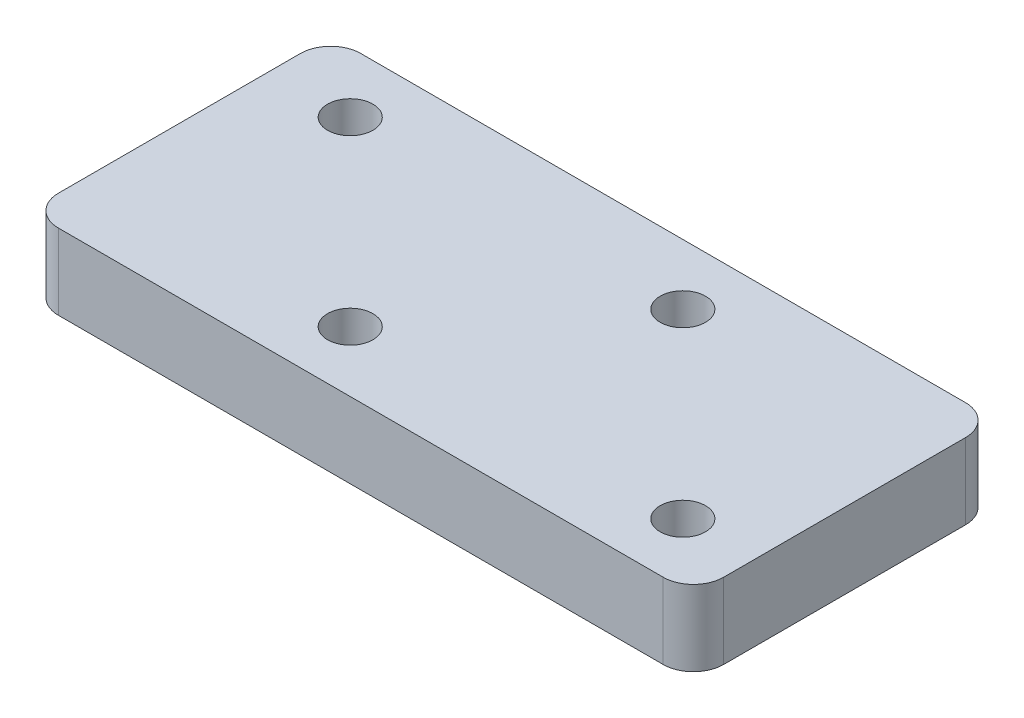
ISO-10303-21;
HEADER;
FILE_DESCRIPTION(('STEP AP214'),'2;1');
FILE_NAME('part.step','',(''),(''),'','','');
FILE_SCHEMA(('AUTOMOTIVE_DESIGN { 1 0 10303 214 1 1 1 1 }'));
ENDSEC;
DATA;
#1=APPLICATION_CONTEXT('core data for automotive mechanical design processes');
#2=APPLICATION_PROTOCOL_DEFINITION('international standard','automotive_design',2000,#1);
#3=PRODUCT_CONTEXT('',#1,'mechanical');
#4=PRODUCT('Part','Part','',(#3));
#5=PRODUCT_RELATED_PRODUCT_CATEGORY('part','',(#4));
#6=PRODUCT_DEFINITION_FORMATION('','',#4);
#7=PRODUCT_DEFINITION_CONTEXT('part definition',#1,'design');
#8=PRODUCT_DEFINITION('design','',#6,#7);
#9=PRODUCT_DEFINITION_SHAPE('','',#8);
#10=(LENGTH_UNIT() NAMED_UNIT(*) SI_UNIT(.MILLI.,.METRE.));
#11=(NAMED_UNIT(*) PLANE_ANGLE_UNIT() SI_UNIT($,.RADIAN.));
#12=(NAMED_UNIT(*) SI_UNIT($,.STERADIAN.) SOLID_ANGLE_UNIT());
#13=UNCERTAINTY_MEASURE_WITH_UNIT(LENGTH_MEASURE(1.E-05),#10,'distance_accuracy_value','');
#14=(GEOMETRIC_REPRESENTATION_CONTEXT(3) GLOBAL_UNCERTAINTY_ASSIGNED_CONTEXT((#13)) GLOBAL_UNIT_ASSIGNED_CONTEXT((#10,
#11,#12)) REPRESENTATION_CONTEXT('',''));
#15=CARTESIAN_POINT('',(0.,0.,0.));
#16=DIRECTION('',(0.,0.,1.));
#17=DIRECTION('',(1.,0.,0.));
#18=AXIS2_PLACEMENT_3D('',#15,#16,#17);
#19=CARTESIAN_POINT('',(0.,5.,0.));
#20=DIRECTION('',(0.,-1.,0.));
#21=DIRECTION('',(0.,0.,-1.));
#22=AXIS2_PLACEMENT_3D('',#19,#20,#21);
#23=PLANE('',#22);
#24=DIRECTION('',(0.,0.,-1.));
#25=VECTOR('',#24,1.);
#26=CARTESIAN_POINT('',(44.,5.,0.));
#27=LINE('',#26,#25);
#28=CARTESIAN_POINT('',(44.,5.,-2.));
#29=VERTEX_POINT('',#28);
#30=CARTESIAN_POINT('',(44.,5.,-18.));
#31=VERTEX_POINT('',#30);
#32=EDGE_CURVE('E202',#29,#31,#27,.T.);
#33=ORIENTED_EDGE('',*,*,#32,.T.);
#34=CARTESIAN_POINT('',(42.,5.,-18.));
#35=DIRECTION('',(0.,-1.,0.));
#36=DIRECTION('',(0.,0.,-1.));
#37=AXIS2_PLACEMENT_3D('',#34,#35,#36);
#38=CIRCLE('',#37,2.);
#39=CARTESIAN_POINT('',(42.,5.,-20.));
#40=VERTEX_POINT('',#39);
#41=EDGE_CURVE('E174',#31,#40,#38,.F.);
#42=ORIENTED_EDGE('',*,*,#41,.T.);
#43=DIRECTION('',(-1.,0.,0.));
#44=VECTOR('',#43,1.);
#45=CARTESIAN_POINT('',(0.,5.,-20.));
#46=LINE('',#45,#44);
#47=CARTESIAN_POINT('',(2.,5.,-20.));
#48=VERTEX_POINT('',#47);
#49=EDGE_CURVE('E135',#40,#48,#46,.T.);
#50=ORIENTED_EDGE('',*,*,#49,.T.);
#51=CARTESIAN_POINT('',(2.,5.,-18.));
#52=DIRECTION('',(0.,-1.,0.));
#53=DIRECTION('',(0.,0.,-1.));
#54=AXIS2_PLACEMENT_3D('',#51,#52,#53);
#55=CIRCLE('',#54,2.);
#56=CARTESIAN_POINT('',(0.,5.,-18.));
#57=VERTEX_POINT('',#56);
#58=EDGE_CURVE('E167',#48,#57,#55,.F.);
#59=ORIENTED_EDGE('',*,*,#58,.T.);
#60=DIRECTION('',(0.,0.,1.));
#61=VECTOR('',#60,1.);
#62=CARTESIAN_POINT('',(0.,5.,0.));
#63=LINE('',#62,#61);
#64=CARTESIAN_POINT('',(0.,5.,-2.));
#65=VERTEX_POINT('',#64);
#66=EDGE_CURVE('E143',#57,#65,#63,.T.);
#67=ORIENTED_EDGE('',*,*,#66,.T.);
#68=CARTESIAN_POINT('',(2.,5.,-2.));
#69=DIRECTION('',(0.,-1.,0.));
#70=DIRECTION('',(0.,0.,-1.));
#71=AXIS2_PLACEMENT_3D('',#68,#69,#70);
#72=CIRCLE('',#71,2.);
#73=CARTESIAN_POINT('',(2.,5.,0.));
#74=VERTEX_POINT('',#73);
#75=EDGE_CURVE('E70',#65,#74,#72,.F.);
#76=ORIENTED_EDGE('',*,*,#75,.T.);
#77=DIRECTION('',(1.,0.,0.));
#78=VECTOR('',#77,1.);
#79=CARTESIAN_POINT('',(0.,5.,0.));
#80=LINE('',#79,#78);
#81=CARTESIAN_POINT('',(42.,5.,0.));
#82=VERTEX_POINT('',#81);
#83=EDGE_CURVE('E148',#74,#82,#80,.T.);
#84=ORIENTED_EDGE('',*,*,#83,.T.);
#85=CARTESIAN_POINT('',(42.,5.,-2.));
#86=DIRECTION('',(0.,-1.,0.));
#87=DIRECTION('',(0.,0.,-1.));
#88=AXIS2_PLACEMENT_3D('',#85,#86,#87);
#89=CIRCLE('',#88,2.);
#90=EDGE_CURVE('E173',#82,#29,#89,.F.);
#91=ORIENTED_EDGE('',*,*,#90,.T.);
#92=EDGE_LOOP('',(#33,#42,#50,#59,#67,#76,#84,#91));
#93=FACE_BOUND('',#92,.T.);
#94=CARTESIAN_POINT('',(5.3,5.,-16.));
#95=DIRECTION('',(0.,1.,0.));
#96=DIRECTION('',(0.,0.,1.));
#97=AXIS2_PLACEMENT_3D('',#94,#95,#96);
#98=CIRCLE('',#97,1.5);
#99=CARTESIAN_POINT('',(5.3,5.,-14.5));
#100=VERTEX_POINT('',#99);
#101=EDGE_CURVE('E193',#100,#100,#98,.T.);
#102=ORIENTED_EDGE('',*,*,#101,.F.);
#103=EDGE_LOOP('',(#102));
#104=FACE_BOUND('',#103,.T.);
#105=CARTESIAN_POINT('',(17.3,5.,-4.));
#106=DIRECTION('',(0.,1.,0.));
#107=DIRECTION('',(0.,0.,1.));
#108=AXIS2_PLACEMENT_3D('',#105,#106,#107);
#109=CIRCLE('',#108,1.5);
#110=CARTESIAN_POINT('',(17.3,5.,-2.5));
#111=VERTEX_POINT('',#110);
#112=EDGE_CURVE('E213',#111,#111,#109,.T.);
#113=ORIENTED_EDGE('',*,*,#112,.F.);
#114=EDGE_LOOP('',(#113));
#115=FACE_BOUND('',#114,.T.);
#116=CARTESIAN_POINT('',(27.3,5.,-16.));
#117=DIRECTION('',(0.,1.,0.));
#118=DIRECTION('',(0.,0.,1.));
#119=AXIS2_PLACEMENT_3D('',#116,#117,#118);
#120=CIRCLE('',#119,1.5);
#121=CARTESIAN_POINT('',(27.3,5.,-14.5));
#122=VERTEX_POINT('',#121);
#123=EDGE_CURVE('E218',#122,#122,#120,.T.);
#124=ORIENTED_EDGE('',*,*,#123,.F.);
#125=EDGE_LOOP('',(#124));
#126=FACE_BOUND('',#125,.T.);
#127=CARTESIAN_POINT('',(39.3,5.,-4.));
#128=DIRECTION('',(0.,1.,0.));
#129=DIRECTION('',(0.,0.,1.));
#130=AXIS2_PLACEMENT_3D('',#127,#128,#129);
#131=CIRCLE('',#130,1.5);
#132=CARTESIAN_POINT('',(39.3,5.,-2.5));
#133=VERTEX_POINT('',#132);
#134=EDGE_CURVE('E230',#133,#133,#131,.T.);
#135=ORIENTED_EDGE('',*,*,#134,.F.);
#136=EDGE_LOOP('',(#135));
#137=FACE_BOUND('',#136,.T.);
#138=ADVANCED_FACE('F42',(#93,#104,#115,#126,#137),#23,.F.);
#139=CARTESIAN_POINT('',(0.,0.,0.));
#140=DIRECTION('',(0.,-1.,0.));
#141=DIRECTION('',(0.,0.,-1.));
#142=AXIS2_PLACEMENT_3D('',#139,#140,#141);
#143=PLANE('',#142);
#144=CARTESIAN_POINT('',(27.3,0.,-16.));
#145=DIRECTION('',(0.,1.,0.));
#146=DIRECTION('',(0.,0.,1.));
#147=AXIS2_PLACEMENT_3D('',#144,#145,#146);
#148=CIRCLE('',#147,1.5);
#149=CARTESIAN_POINT('',(27.3,0.,-14.5));
#150=VERTEX_POINT('',#149);
#151=EDGE_CURVE('E224',#150,#150,#148,.T.);
#152=ORIENTED_EDGE('',*,*,#151,.T.);
#153=EDGE_LOOP('',(#152));
#154=FACE_BOUND('',#153,.T.);
#155=CARTESIAN_POINT('',(5.3,0.,-16.));
#156=DIRECTION('',(0.,1.,0.));
#157=DIRECTION('',(0.,0.,1.));
#158=AXIS2_PLACEMENT_3D('',#155,#156,#157);
#159=CIRCLE('',#158,1.5);
#160=CARTESIAN_POINT('',(5.3,0.,-14.5));
#161=VERTEX_POINT('',#160);
#162=EDGE_CURVE('E199',#161,#161,#159,.T.);
#163=ORIENTED_EDGE('',*,*,#162,.T.);
#164=EDGE_LOOP('',(#163));
#165=FACE_BOUND('',#164,.T.);
#166=DIRECTION('',(-1.,0.,0.));
#167=VECTOR('',#166,1.);
#168=CARTESIAN_POINT('',(0.,0.,-20.));
#169=LINE('',#168,#167);
#170=CARTESIAN_POINT('',(42.,0.,-20.));
#171=VERTEX_POINT('',#170);
#172=CARTESIAN_POINT('',(2.,0.,-20.));
#173=VERTEX_POINT('',#172);
#174=EDGE_CURVE('E129',#171,#173,#169,.T.);
#175=ORIENTED_EDGE('',*,*,#174,.F.);
#176=CARTESIAN_POINT('',(42.,0.,-18.));
#177=DIRECTION('',(0.,-1.,0.));
#178=DIRECTION('',(0.,0.,-1.));
#179=AXIS2_PLACEMENT_3D('',#176,#177,#178);
#180=CIRCLE('',#179,2.);
#181=CARTESIAN_POINT('',(44.,0.,-18.));
#182=VERTEX_POINT('',#181);
#183=EDGE_CURVE('E112',#171,#182,#180,.T.);
#184=ORIENTED_EDGE('',*,*,#183,.T.);
#185=DIRECTION('',(0.,0.,-1.));
#186=VECTOR('',#185,1.);
#187=CARTESIAN_POINT('',(44.,0.,0.));
#188=LINE('',#187,#186);
#189=CARTESIAN_POINT('',(44.,0.,-2.));
#190=VERTEX_POINT('',#189);
#191=EDGE_CURVE('E142',#190,#182,#188,.T.);
#192=ORIENTED_EDGE('',*,*,#191,.F.);
#193=CARTESIAN_POINT('',(42.,0.,-2.));
#194=DIRECTION('',(0.,-1.,0.));
#195=DIRECTION('',(0.,0.,-1.));
#196=AXIS2_PLACEMENT_3D('',#193,#194,#195);
#197=CIRCLE('',#196,2.);
#198=CARTESIAN_POINT('',(42.,0.,0.));
#199=VERTEX_POINT('',#198);
#200=EDGE_CURVE('E124',#190,#199,#197,.T.);
#201=ORIENTED_EDGE('',*,*,#200,.T.);
#202=DIRECTION('',(1.,0.,0.));
#203=VECTOR('',#202,1.);
#204=CARTESIAN_POINT('',(0.,0.,0.));
#205=LINE('',#204,#203);
#206=CARTESIAN_POINT('',(2.,0.,0.));
#207=VERTEX_POINT('',#206);
#208=EDGE_CURVE('E146',#207,#199,#205,.T.);
#209=ORIENTED_EDGE('',*,*,#208,.F.);
#210=CARTESIAN_POINT('',(2.,0.,-2.));
#211=DIRECTION('',(0.,-1.,0.));
#212=DIRECTION('',(0.,0.,-1.));
#213=AXIS2_PLACEMENT_3D('',#210,#211,#212);
#214=CIRCLE('',#213,2.);
#215=CARTESIAN_POINT('',(0.,0.,-2.));
#216=VERTEX_POINT('',#215);
#217=EDGE_CURVE('E156',#207,#216,#214,.T.);
#218=ORIENTED_EDGE('',*,*,#217,.T.);
#219=DIRECTION('',(0.,0.,1.));
#220=VECTOR('',#219,1.);
#221=CARTESIAN_POINT('',(0.,0.,0.));
#222=LINE('',#221,#220);
#223=CARTESIAN_POINT('',(0.,0.,-18.));
#224=VERTEX_POINT('',#223);
#225=EDGE_CURVE('E189',#224,#216,#222,.T.);
#226=ORIENTED_EDGE('',*,*,#225,.F.);
#227=CARTESIAN_POINT('',(2.,0.,-18.));
#228=DIRECTION('',(0.,-1.,0.));
#229=DIRECTION('',(0.,0.,-1.));
#230=AXIS2_PLACEMENT_3D('',#227,#228,#229);
#231=CIRCLE('',#230,2.);
#232=EDGE_CURVE('E134',#224,#173,#231,.T.);
#233=ORIENTED_EDGE('',*,*,#232,.T.);
#234=EDGE_LOOP('',(#175,#184,#192,#201,#209,#218,#226,#233));
#235=FACE_BOUND('',#234,.T.);
#236=CARTESIAN_POINT('',(17.3,0.,-4.));
#237=DIRECTION('',(0.,1.,0.));
#238=DIRECTION('',(0.,0.,1.));
#239=AXIS2_PLACEMENT_3D('',#236,#237,#238);
#240=CIRCLE('',#239,1.5);
#241=CARTESIAN_POINT('',(17.3,0.,-2.5));
#242=VERTEX_POINT('',#241);
#243=EDGE_CURVE('E214',#242,#242,#240,.T.);
#244=ORIENTED_EDGE('',*,*,#243,.T.);
#245=EDGE_LOOP('',(#244));
#246=FACE_BOUND('',#245,.T.);
#247=CARTESIAN_POINT('',(39.3,0.,-4.));
#248=DIRECTION('',(0.,1.,0.));
#249=DIRECTION('',(0.,0.,1.));
#250=AXIS2_PLACEMENT_3D('',#247,#248,#249);
#251=CIRCLE('',#250,1.5);
#252=CARTESIAN_POINT('',(39.3,0.,-2.5));
#253=VERTEX_POINT('',#252);
#254=EDGE_CURVE('E232',#253,#253,#251,.T.);
#255=ORIENTED_EDGE('',*,*,#254,.T.);
#256=EDGE_LOOP('',(#255));
#257=FACE_BOUND('',#256,.T.);
#258=ADVANCED_FACE('F140',(#154,#165,#235,#246,#257),#143,.T.);
#259=CARTESIAN_POINT('',(0.,5.,0.));
#260=DIRECTION('',(1.,0.,0.));
#261=DIRECTION('',(0.,0.,-1.));
#262=AXIS2_PLACEMENT_3D('',#259,#260,#261);
#263=PLANE('',#262);
#264=ORIENTED_EDGE('',*,*,#225,.T.);
#265=DIRECTION('',(0.,-1.,0.));
#266=VECTOR('',#265,1.);
#267=CARTESIAN_POINT('',(0.,5.,-2.));
#268=LINE('',#267,#266);
#269=EDGE_CURVE('E11',#216,#65,#268,.F.);
#270=ORIENTED_EDGE('',*,*,#269,.T.);
#271=ORIENTED_EDGE('',*,*,#66,.F.);
#272=DIRECTION('',(0.,-1.,0.));
#273=VECTOR('',#272,1.);
#274=CARTESIAN_POINT('',(0.,5.,-18.));
#275=LINE('',#274,#273);
#276=EDGE_CURVE('E52',#57,#224,#275,.T.);
#277=ORIENTED_EDGE('',*,*,#276,.T.);
#278=EDGE_LOOP('',(#264,#270,#271,#277));
#279=FACE_BOUND('',#278,.T.);
#280=ADVANCED_FACE('F186',(#279),#263,.F.);
#281=CARTESIAN_POINT('',(0.,5.,0.));
#282=DIRECTION('',(0.,0.,-1.));
#283=DIRECTION('',(-1.,0.,0.));
#284=AXIS2_PLACEMENT_3D('',#281,#282,#283);
#285=PLANE('',#284);
#286=ORIENTED_EDGE('',*,*,#208,.T.);
#287=DIRECTION('',(0.,-1.,0.));
#288=VECTOR('',#287,1.);
#289=CARTESIAN_POINT('',(42.,5.,0.));
#290=LINE('',#289,#288);
#291=EDGE_CURVE('E58',#199,#82,#290,.F.);
#292=ORIENTED_EDGE('',*,*,#291,.T.);
#293=ORIENTED_EDGE('',*,*,#83,.F.);
#294=DIRECTION('',(0.,-1.,0.));
#295=VECTOR('',#294,1.);
#296=CARTESIAN_POINT('',(2.,5.,0.));
#297=LINE('',#296,#295);
#298=EDGE_CURVE('E180',#74,#207,#297,.T.);
#299=ORIENTED_EDGE('',*,*,#298,.T.);
#300=EDGE_LOOP('',(#286,#292,#293,#299));
#301=FACE_BOUND('',#300,.T.);
#302=ADVANCED_FACE('F257',(#301),#285,.F.);
#303=CARTESIAN_POINT('',(44.,5.,0.));
#304=DIRECTION('',(-1.,0.,0.));
#305=DIRECTION('',(0.,0.,1.));
#306=AXIS2_PLACEMENT_3D('',#303,#304,#305);
#307=PLANE('',#306);
#308=ORIENTED_EDGE('',*,*,#191,.T.);
#309=DIRECTION('',(0.,-1.,0.));
#310=VECTOR('',#309,1.);
#311=CARTESIAN_POINT('',(44.,5.,-18.));
#312=LINE('',#311,#310);
#313=EDGE_CURVE('E118',#182,#31,#312,.F.);
#314=ORIENTED_EDGE('',*,*,#313,.T.);
#315=ORIENTED_EDGE('',*,*,#32,.F.);
#316=DIRECTION('',(0.,-1.,0.));
#317=VECTOR('',#316,1.);
#318=CARTESIAN_POINT('',(44.,5.,-2.));
#319=LINE('',#318,#317);
#320=EDGE_CURVE('E125',#29,#190,#319,.T.);
#321=ORIENTED_EDGE('',*,*,#320,.T.);
#322=EDGE_LOOP('',(#308,#314,#315,#321));
#323=FACE_BOUND('',#322,.T.);
#324=ADVANCED_FACE('F260',(#323),#307,.F.);
#325=CARTESIAN_POINT('',(0.,5.,-20.));
#326=DIRECTION('',(0.,0.,1.));
#327=DIRECTION('',(1.,0.,0.));
#328=AXIS2_PLACEMENT_3D('',#325,#326,#327);
#329=PLANE('',#328);
#330=ORIENTED_EDGE('',*,*,#49,.F.);
#331=DIRECTION('',(0.,-1.,0.));
#332=VECTOR('',#331,1.);
#333=CARTESIAN_POINT('',(42.,5.,-20.));
#334=LINE('',#333,#332);
#335=EDGE_CURVE('E113',#40,#171,#334,.T.);
#336=ORIENTED_EDGE('',*,*,#335,.T.);
#337=ORIENTED_EDGE('',*,*,#174,.T.);
#338=DIRECTION('',(0.,-1.,0.));
#339=VECTOR('',#338,1.);
#340=CARTESIAN_POINT('',(2.,5.,-20.));
#341=LINE('',#340,#339);
#342=EDGE_CURVE('E132',#173,#48,#341,.F.);
#343=ORIENTED_EDGE('',*,*,#342,.T.);
#344=EDGE_LOOP('',(#330,#336,#337,#343));
#345=FACE_BOUND('',#344,.T.);
#346=ADVANCED_FACE('F126',(#345),#329,.F.);
#347=CARTESIAN_POINT('',(5.3,5.,-16.));
#348=DIRECTION('',(0.,-1.,0.));
#349=DIRECTION('',(0.,0.,-1.));
#350=AXIS2_PLACEMENT_3D('',#347,#348,#349);
#351=CYLINDRICAL_SURFACE('',#350,1.5);
#352=ORIENTED_EDGE('',*,*,#101,.T.);
#353=EDGE_LOOP('',(#352));
#354=FACE_BOUND('',#353,.T.);
#355=ORIENTED_EDGE('',*,*,#162,.F.);
#356=EDGE_LOOP('',(#355));
#357=FACE_BOUND('',#356,.T.);
#358=ADVANCED_FACE('F252',(#354,#357),#351,.F.);
#359=CARTESIAN_POINT('',(17.3,5.,-4.));
#360=DIRECTION('',(0.,-1.,0.));
#361=DIRECTION('',(0.,0.,-1.));
#362=AXIS2_PLACEMENT_3D('',#359,#360,#361);
#363=CYLINDRICAL_SURFACE('',#362,1.5);
#364=ORIENTED_EDGE('',*,*,#112,.T.);
#365=EDGE_LOOP('',(#364));
#366=FACE_BOUND('',#365,.T.);
#367=ORIENTED_EDGE('',*,*,#243,.F.);
#368=EDGE_LOOP('',(#367));
#369=FACE_BOUND('',#368,.T.);
#370=ADVANCED_FACE('F320',(#366,#369),#363,.F.);
#371=CARTESIAN_POINT('',(27.3,5.,-16.));
#372=DIRECTION('',(0.,-1.,0.));
#373=DIRECTION('',(0.,0.,-1.));
#374=AXIS2_PLACEMENT_3D('',#371,#372,#373);
#375=CYLINDRICAL_SURFACE('',#374,1.5);
#376=ORIENTED_EDGE('',*,*,#123,.T.);
#377=EDGE_LOOP('',(#376));
#378=FACE_BOUND('',#377,.T.);
#379=ORIENTED_EDGE('',*,*,#151,.F.);
#380=EDGE_LOOP('',(#379));
#381=FACE_BOUND('',#380,.T.);
#382=ADVANCED_FACE('F306',(#378,#381),#375,.F.);
#383=CARTESIAN_POINT('',(39.3,5.,-4.));
#384=DIRECTION('',(0.,-1.,0.));
#385=DIRECTION('',(0.,0.,-1.));
#386=AXIS2_PLACEMENT_3D('',#383,#384,#385);
#387=CYLINDRICAL_SURFACE('',#386,1.5);
#388=ORIENTED_EDGE('',*,*,#134,.T.);
#389=EDGE_LOOP('',(#388));
#390=FACE_BOUND('',#389,.T.);
#391=ORIENTED_EDGE('',*,*,#254,.F.);
#392=EDGE_LOOP('',(#391));
#393=FACE_BOUND('',#392,.T.);
#394=ADVANCED_FACE('F239',(#390,#393),#387,.F.);
#395=CARTESIAN_POINT('',(42.,5.,-18.));
#396=DIRECTION('',(0.,-1.,0.));
#397=DIRECTION('',(0.,0.,-1.));
#398=AXIS2_PLACEMENT_3D('',#395,#396,#397);
#399=CYLINDRICAL_SURFACE('',#398,2.);
#400=ORIENTED_EDGE('',*,*,#41,.F.);
#401=ORIENTED_EDGE('',*,*,#313,.F.);
#402=ORIENTED_EDGE('',*,*,#183,.F.);
#403=ORIENTED_EDGE('',*,*,#335,.F.);
#404=EDGE_LOOP('',(#400,#401,#402,#403));
#405=FACE_BOUND('',#404,.T.);
#406=ADVANCED_FACE('F111',(#405),#399,.T.);
#407=CARTESIAN_POINT('',(42.,5.,-2.));
#408=DIRECTION('',(0.,-1.,0.));
#409=DIRECTION('',(0.,0.,-1.));
#410=AXIS2_PLACEMENT_3D('',#407,#408,#409);
#411=CYLINDRICAL_SURFACE('',#410,2.);
#412=ORIENTED_EDGE('',*,*,#90,.F.);
#413=ORIENTED_EDGE('',*,*,#291,.F.);
#414=ORIENTED_EDGE('',*,*,#200,.F.);
#415=ORIENTED_EDGE('',*,*,#320,.F.);
#416=EDGE_LOOP('',(#412,#413,#414,#415));
#417=FACE_BOUND('',#416,.T.);
#418=ADVANCED_FACE('F268',(#417),#411,.T.);
#419=CARTESIAN_POINT('',(2.,5.,-2.));
#420=DIRECTION('',(0.,-1.,0.));
#421=DIRECTION('',(0.,0.,-1.));
#422=AXIS2_PLACEMENT_3D('',#419,#420,#421);
#423=CYLINDRICAL_SURFACE('',#422,2.);
#424=ORIENTED_EDGE('',*,*,#75,.F.);
#425=ORIENTED_EDGE('',*,*,#269,.F.);
#426=ORIENTED_EDGE('',*,*,#217,.F.);
#427=ORIENTED_EDGE('',*,*,#298,.F.);
#428=EDGE_LOOP('',(#424,#425,#426,#427));
#429=FACE_BOUND('',#428,.T.);
#430=ADVANCED_FACE('F269',(#429),#423,.T.);
#431=CARTESIAN_POINT('',(2.,5.,-18.));
#432=DIRECTION('',(0.,-1.,0.));
#433=DIRECTION('',(0.,0.,-1.));
#434=AXIS2_PLACEMENT_3D('',#431,#432,#433);
#435=CYLINDRICAL_SURFACE('',#434,2.);
#436=ORIENTED_EDGE('',*,*,#58,.F.);
#437=ORIENTED_EDGE('',*,*,#342,.F.);
#438=ORIENTED_EDGE('',*,*,#232,.F.);
#439=ORIENTED_EDGE('',*,*,#276,.F.);
#440=EDGE_LOOP('',(#436,#437,#438,#439));
#441=FACE_BOUND('',#440,.T.);
#442=ADVANCED_FACE('F46',(#441),#435,.T.);
#443=CLOSED_SHELL('',(#138,#258,#280,#302,#324,#346,#358,#370,#382,#394,#406,#418,#430,#442));
#444=MANIFOLD_SOLID_BREP('B2',#443);
#445=ADVANCED_BREP_SHAPE_REPRESENTATION('',(#18,#444),#14);
#446=SHAPE_DEFINITION_REPRESENTATION(#9,#445);
ENDSEC;
END-ISO-10303-21;
